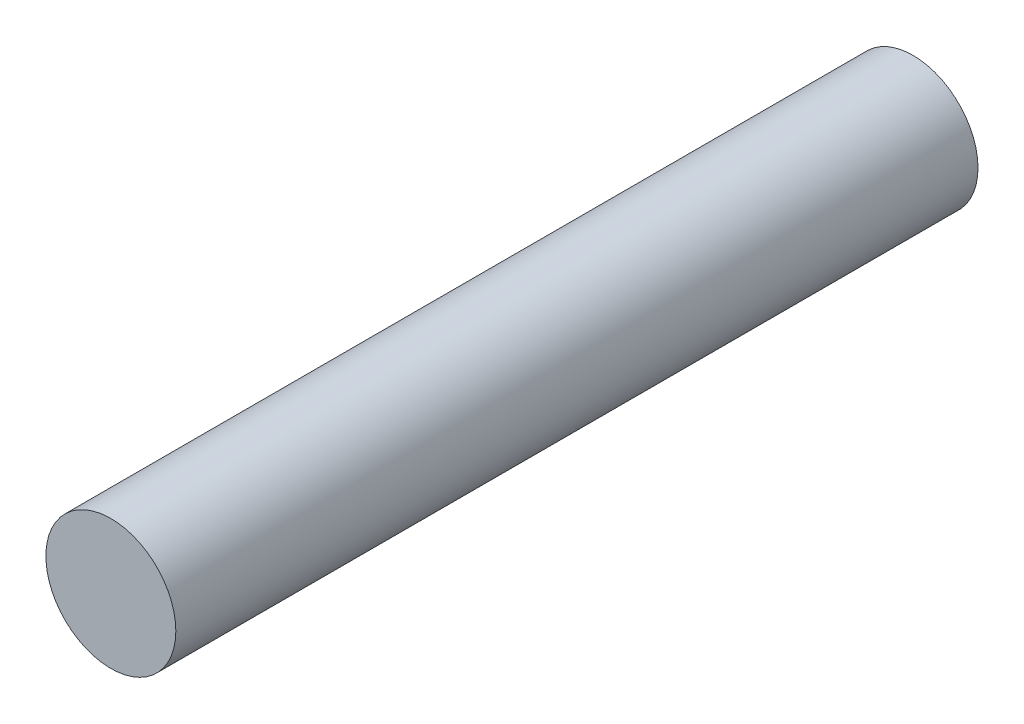
ISO-10303-21;
HEADER;
FILE_DESCRIPTION(('STEP AP214'),'2;1');
FILE_NAME('part.step','',(''),(''),'','','');
FILE_SCHEMA(('AUTOMOTIVE_DESIGN { 1 0 10303 214 1 1 1 1 }'));
ENDSEC;
DATA;
#1=APPLICATION_CONTEXT('core data for automotive mechanical design processes');
#2=APPLICATION_PROTOCOL_DEFINITION('international standard','automotive_design',2000,#1);
#3=PRODUCT_CONTEXT('',#1,'mechanical');
#4=PRODUCT('Part','Part','',(#3));
#5=PRODUCT_RELATED_PRODUCT_CATEGORY('part','',(#4));
#6=PRODUCT_DEFINITION_FORMATION('','',#4);
#7=PRODUCT_DEFINITION_CONTEXT('part definition',#1,'design');
#8=PRODUCT_DEFINITION('design','',#6,#7);
#9=PRODUCT_DEFINITION_SHAPE('','',#8);
#10=(LENGTH_UNIT() NAMED_UNIT(*) SI_UNIT(.MILLI.,.METRE.));
#11=(NAMED_UNIT(*) PLANE_ANGLE_UNIT() SI_UNIT($,.RADIAN.));
#12=(NAMED_UNIT(*) SI_UNIT($,.STERADIAN.) SOLID_ANGLE_UNIT());
#13=UNCERTAINTY_MEASURE_WITH_UNIT(LENGTH_MEASURE(1.E-05),#10,'distance_accuracy_value','');
#14=(GEOMETRIC_REPRESENTATION_CONTEXT(3) GLOBAL_UNCERTAINTY_ASSIGNED_CONTEXT((#13)) GLOBAL_UNIT_ASSIGNED_CONTEXT((#10,
#11,#12)) REPRESENTATION_CONTEXT('',''));
#15=CARTESIAN_POINT('',(0.,0.,0.));
#16=DIRECTION('',(0.,0.,1.));
#17=DIRECTION('',(1.,0.,0.));
#18=AXIS2_PLACEMENT_3D('',#15,#16,#17);
#19=CARTESIAN_POINT('',(-5.36,0.0375,-3.9875));
#20=DIRECTION('',(0.,0.,-1.));
#21=DIRECTION('',(-1.,0.,0.));
#22=AXIS2_PLACEMENT_3D('',#19,#20,#21);
#23=PLANE('',#22);
#24=CARTESIAN_POINT('',(-5.36,0.0375,-3.9875));
#25=DIRECTION('',(0.,0.,1.));
#26=DIRECTION('',(1.,0.,0.));
#27=AXIS2_PLACEMENT_3D('',#24,#25,#26);
#28=CIRCLE('',#27,0.405);
#29=CARTESIAN_POINT('',(-4.955,0.0375,-3.9875));
#30=VERTEX_POINT('',#29);
#31=EDGE_CURVE('E21',#30,#30,#28,.T.);
#32=ORIENTED_EDGE('',*,*,#31,.F.);
#33=EDGE_LOOP('',(#32));
#34=FACE_BOUND('',#33,.T.);
#35=ADVANCED_FACE('F14',(#34),#23,.T.);
#36=CARTESIAN_POINT('',(-5.36,0.0375,1.0125));
#37=DIRECTION('',(0.,0.,-1.));
#38=DIRECTION('',(-1.,0.,0.));
#39=AXIS2_PLACEMENT_3D('',#36,#37,#38);
#40=PLANE('',#39);
#41=CARTESIAN_POINT('',(-5.36,0.0375,1.0125));
#42=DIRECTION('',(0.,0.,1.));
#43=DIRECTION('',(1.,0.,0.));
#44=AXIS2_PLACEMENT_3D('',#41,#42,#43);
#45=CIRCLE('',#44,0.405);
#46=CARTESIAN_POINT('',(-4.955,0.0375,1.0125));
#47=VERTEX_POINT('',#46);
#48=EDGE_CURVE('E9',#47,#47,#45,.F.);
#49=ORIENTED_EDGE('',*,*,#48,.F.);
#50=EDGE_LOOP('',(#49));
#51=FACE_BOUND('',#50,.T.);
#52=ADVANCED_FACE('F33',(#51),#40,.F.);
#53=CARTESIAN_POINT('',(-5.36,0.0375,-3.9875));
#54=DIRECTION('',(0.,0.,1.));
#55=DIRECTION('',(1.,0.,0.));
#56=AXIS2_PLACEMENT_3D('',#53,#54,#55);
#57=CYLINDRICAL_SURFACE('',#56,0.405);
#58=ORIENTED_EDGE('',*,*,#48,.T.);
#59=EDGE_LOOP('',(#58));
#60=FACE_BOUND('',#59,.T.);
#61=ORIENTED_EDGE('',*,*,#31,.T.);
#62=EDGE_LOOP('',(#61));
#63=FACE_BOUND('',#62,.T.);
#64=ADVANCED_FACE('F30',(#60,#63),#57,.T.);
#65=CLOSED_SHELL('',(#35,#52,#64));
#66=MANIFOLD_SOLID_BREP('B1',#65);
#67=ADVANCED_BREP_SHAPE_REPRESENTATION('',(#18,#66),#14);
#68=SHAPE_DEFINITION_REPRESENTATION(#9,#67);
ENDSEC;
END-ISO-10303-21;
